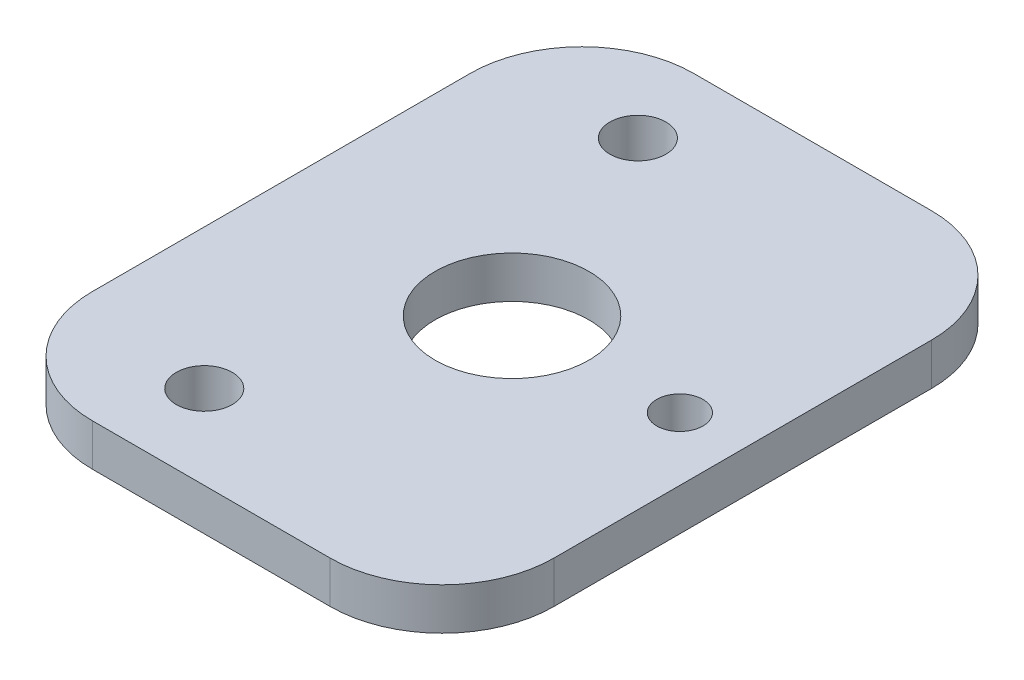
ISO-10303-21;
HEADER;
FILE_DESCRIPTION(('STEP AP214'),'2;1');
FILE_NAME('part.step','',(''),(''),'','','');
FILE_SCHEMA(('AUTOMOTIVE_DESIGN { 1 0 10303 214 1 1 1 1 }'));
ENDSEC;
DATA;
#1=APPLICATION_CONTEXT('core data for automotive mechanical design processes');
#2=APPLICATION_PROTOCOL_DEFINITION('international standard','automotive_design',2000,#1);
#3=PRODUCT_CONTEXT('',#1,'mechanical');
#4=PRODUCT('Part','Part','',(#3));
#5=PRODUCT_RELATED_PRODUCT_CATEGORY('part','',(#4));
#6=PRODUCT_DEFINITION_FORMATION('','',#4);
#7=PRODUCT_DEFINITION_CONTEXT('part definition',#1,'design');
#8=PRODUCT_DEFINITION('design','',#6,#7);
#9=PRODUCT_DEFINITION_SHAPE('','',#8);
#10=(LENGTH_UNIT() NAMED_UNIT(*) SI_UNIT(.MILLI.,.METRE.));
#11=(NAMED_UNIT(*) PLANE_ANGLE_UNIT() SI_UNIT($,.RADIAN.));
#12=(NAMED_UNIT(*) SI_UNIT($,.STERADIAN.) SOLID_ANGLE_UNIT());
#13=UNCERTAINTY_MEASURE_WITH_UNIT(LENGTH_MEASURE(1.E-05),#10,'distance_accuracy_value','');
#14=(GEOMETRIC_REPRESENTATION_CONTEXT(3) GLOBAL_UNCERTAINTY_ASSIGNED_CONTEXT((#13)) GLOBAL_UNIT_ASSIGNED_CONTEXT((#10,
#11,#12)) REPRESENTATION_CONTEXT('',''));
#15=CARTESIAN_POINT('',(0.,0.,0.));
#16=DIRECTION('',(0.,0.,1.));
#17=DIRECTION('',(1.,0.,0.));
#18=AXIS2_PLACEMENT_3D('',#15,#16,#17);
#19=CARTESIAN_POINT('',(0.,3.,0.));
#20=DIRECTION('',(0.,1.,0.));
#21=DIRECTION('',(0.,0.,1.));
#22=AXIS2_PLACEMENT_3D('',#19,#20,#21);
#23=PLANE('',#22);
#24=CARTESIAN_POINT('',(-6.49999999999999,3.,-15.5));
#25=DIRECTION('',(0.,1.,0.));
#26=DIRECTION('',(0.,0.,1.));
#27=AXIS2_PLACEMENT_3D('',#24,#25,#26);
#28=CIRCLE('',#27,2.00000000000001);
#29=CARTESIAN_POINT('',(-6.49999999999999,3.,-13.5));
#30=VERTEX_POINT('',#29);
#31=EDGE_CURVE('E147',#30,#30,#28,.T.);
#32=ORIENTED_EDGE('',*,*,#31,.F.);
#33=EDGE_LOOP('',(#32));
#34=FACE_BOUND('',#33,.T.);
#35=CARTESIAN_POINT('',(-6.49999999999998,3.,15.5));
#36=DIRECTION('',(0.,1.,0.));
#37=DIRECTION('',(0.,0.,1.));
#38=AXIS2_PLACEMENT_3D('',#35,#36,#37);
#39=CIRCLE('',#38,2.00000000000001);
#40=CARTESIAN_POINT('',(-6.49999999999998,3.,17.5));
#41=VERTEX_POINT('',#40);
#42=EDGE_CURVE('E202',#41,#41,#39,.T.);
#43=ORIENTED_EDGE('',*,*,#42,.F.);
#44=EDGE_LOOP('',(#43));
#45=FACE_BOUND('',#44,.T.);
#46=CARTESIAN_POINT('',(12.,3.,0.));
#47=DIRECTION('',(0.,1.,0.));
#48=DIRECTION('',(0.,0.,1.));
#49=AXIS2_PLACEMENT_3D('',#46,#47,#48);
#50=CIRCLE('',#49,1.65);
#51=CARTESIAN_POINT('',(12.,3.,1.65));
#52=VERTEX_POINT('',#51);
#53=EDGE_CURVE('E199',#52,#52,#50,.T.);
#54=ORIENTED_EDGE('',*,*,#53,.F.);
#55=EDGE_LOOP('',(#54));
#56=FACE_BOUND('',#55,.T.);
#57=DIRECTION('',(0.,0.,-1.));
#58=VECTOR('',#57,1.);
#59=CARTESIAN_POINT('',(16.5,3.,-21.5));
#60=LINE('',#59,#58);
#61=CARTESIAN_POINT('',(16.5,3.,13.5));
#62=VERTEX_POINT('',#61);
#63=CARTESIAN_POINT('',(16.5,3.,-13.5));
#64=VERTEX_POINT('',#63);
#65=EDGE_CURVE('E142',#62,#64,#60,.T.);
#66=ORIENTED_EDGE('',*,*,#65,.T.);
#67=CARTESIAN_POINT('',(8.5,3.,-13.5));
#68=DIRECTION('',(0.,1.,0.));
#69=DIRECTION('',(0.,0.,1.));
#70=AXIS2_PLACEMENT_3D('',#67,#68,#69);
#71=CIRCLE('',#70,8.);
#72=CARTESIAN_POINT('',(8.5,3.,-21.5));
#73=VERTEX_POINT('',#72);
#74=EDGE_CURVE('E169',#64,#73,#71,.T.);
#75=ORIENTED_EDGE('',*,*,#74,.T.);
#76=DIRECTION('',(-1.,0.,0.));
#77=VECTOR('',#76,1.);
#78=CARTESIAN_POINT('',(-16.5,3.,-21.5));
#79=LINE('',#78,#77);
#80=CARTESIAN_POINT('',(-8.49999999999999,3.,-21.5));
#81=VERTEX_POINT('',#80);
#82=EDGE_CURVE('E124',#73,#81,#79,.T.);
#83=ORIENTED_EDGE('',*,*,#82,.T.);
#84=CARTESIAN_POINT('',(-8.49999999999999,3.,-13.5));
#85=DIRECTION('',(0.,1.,0.));
#86=DIRECTION('',(0.,0.,1.));
#87=AXIS2_PLACEMENT_3D('',#84,#85,#86);
#88=CIRCLE('',#87,8.);
#89=CARTESIAN_POINT('',(-16.5,3.,-13.5));
#90=VERTEX_POINT('',#89);
#91=EDGE_CURVE('E164',#81,#90,#88,.T.);
#92=ORIENTED_EDGE('',*,*,#91,.T.);
#93=DIRECTION('',(0.,0.,1.));
#94=VECTOR('',#93,1.);
#95=CARTESIAN_POINT('',(-16.5,3.,-21.5));
#96=LINE('',#95,#94);
#97=CARTESIAN_POINT('',(-16.5,3.,13.5));
#98=VERTEX_POINT('',#97);
#99=EDGE_CURVE('E180',#90,#98,#96,.T.);
#100=ORIENTED_EDGE('',*,*,#99,.T.);
#101=CARTESIAN_POINT('',(-8.49999999999999,3.,13.5));
#102=DIRECTION('',(0.,1.,0.));
#103=DIRECTION('',(0.,0.,1.));
#104=AXIS2_PLACEMENT_3D('',#101,#102,#103);
#105=CIRCLE('',#104,8.);
#106=CARTESIAN_POINT('',(-8.49999999999999,3.,21.5));
#107=VERTEX_POINT('',#106);
#108=EDGE_CURVE('E60',#98,#107,#105,.T.);
#109=ORIENTED_EDGE('',*,*,#108,.T.);
#110=DIRECTION('',(1.,0.,0.));
#111=VECTOR('',#110,1.);
#112=CARTESIAN_POINT('',(-16.5,3.,21.5));
#113=LINE('',#112,#111);
#114=CARTESIAN_POINT('',(8.50000000000001,3.,21.5));
#115=VERTEX_POINT('',#114);
#116=EDGE_CURVE('E154',#107,#115,#113,.T.);
#117=ORIENTED_EDGE('',*,*,#116,.T.);
#118=CARTESIAN_POINT('',(8.50000000000001,3.,13.5));
#119=DIRECTION('',(0.,1.,0.));
#120=DIRECTION('',(0.,0.,1.));
#121=AXIS2_PLACEMENT_3D('',#118,#119,#120);
#122=CIRCLE('',#121,8.);
#123=EDGE_CURVE('E167',#115,#62,#122,.T.);
#124=ORIENTED_EDGE('',*,*,#123,.T.);
#125=EDGE_LOOP('',(#66,#75,#83,#92,#100,#109,#117,#124));
#126=FACE_BOUND('',#125,.T.);
#127=CARTESIAN_POINT('',(0.,3.,0.));
#128=DIRECTION('',(0.,1.,0.));
#129=DIRECTION('',(0.,0.,1.));
#130=AXIS2_PLACEMENT_3D('',#127,#128,#129);
#131=CIRCLE('',#130,5.5);
#132=CARTESIAN_POINT('',(0.,3.,5.5));
#133=VERTEX_POINT('',#132);
#134=EDGE_CURVE('E137',#133,#133,#131,.T.);
#135=ORIENTED_EDGE('',*,*,#134,.F.);
#136=EDGE_LOOP('',(#135));
#137=FACE_BOUND('',#136,.T.);
#138=ADVANCED_FACE('F38',(#34,#45,#56,#126,#137),#23,.T.);
#139=CARTESIAN_POINT('',(0.,0.,0.));
#140=DIRECTION('',(0.,1.,0.));
#141=DIRECTION('',(0.,0.,1.));
#142=AXIS2_PLACEMENT_3D('',#139,#140,#141);
#143=PLANE('',#142);
#144=CARTESIAN_POINT('',(-6.49999999999999,0.,-15.5));
#145=DIRECTION('',(0.,1.,0.));
#146=DIRECTION('',(0.,0.,1.));
#147=AXIS2_PLACEMENT_3D('',#144,#145,#146);
#148=CIRCLE('',#147,2.00000000000001);
#149=CARTESIAN_POINT('',(-6.49999999999999,0.,-13.5));
#150=VERTEX_POINT('',#149);
#151=EDGE_CURVE('E150',#150,#150,#148,.T.);
#152=ORIENTED_EDGE('',*,*,#151,.T.);
#153=EDGE_LOOP('',(#152));
#154=FACE_BOUND('',#153,.T.);
#155=CARTESIAN_POINT('',(-6.49999999999998,0.,15.5));
#156=DIRECTION('',(0.,1.,0.));
#157=DIRECTION('',(0.,0.,1.));
#158=AXIS2_PLACEMENT_3D('',#155,#156,#157);
#159=CIRCLE('',#158,2.00000000000001);
#160=CARTESIAN_POINT('',(-6.49999999999998,0.,17.5));
#161=VERTEX_POINT('',#160);
#162=EDGE_CURVE('E146',#161,#161,#159,.T.);
#163=ORIENTED_EDGE('',*,*,#162,.T.);
#164=EDGE_LOOP('',(#163));
#165=FACE_BOUND('',#164,.T.);
#166=CARTESIAN_POINT('',(12.,0.,0.));
#167=DIRECTION('',(0.,1.,0.));
#168=DIRECTION('',(0.,0.,1.));
#169=AXIS2_PLACEMENT_3D('',#166,#167,#168);
#170=CIRCLE('',#169,1.65);
#171=CARTESIAN_POINT('',(12.,0.,1.65));
#172=VERTEX_POINT('',#171);
#173=EDGE_CURVE('E143',#172,#172,#170,.T.);
#174=ORIENTED_EDGE('',*,*,#173,.T.);
#175=EDGE_LOOP('',(#174));
#176=FACE_BOUND('',#175,.T.);
#177=DIRECTION('',(-1.,0.,0.));
#178=VECTOR('',#177,1.);
#179=CARTESIAN_POINT('',(-16.5,0.,-21.5));
#180=LINE('',#179,#178);
#181=CARTESIAN_POINT('',(8.5,0.,-21.5));
#182=VERTEX_POINT('',#181);
#183=CARTESIAN_POINT('',(-8.49999999999999,0.,-21.5));
#184=VERTEX_POINT('',#183);
#185=EDGE_CURVE('E121',#182,#184,#180,.T.);
#186=ORIENTED_EDGE('',*,*,#185,.F.);
#187=CARTESIAN_POINT('',(8.5,0.,-13.5));
#188=DIRECTION('',(0.,1.,0.));
#189=DIRECTION('',(0.,0.,1.));
#190=AXIS2_PLACEMENT_3D('',#187,#188,#189);
#191=CIRCLE('',#190,8.);
#192=CARTESIAN_POINT('',(16.5,0.,-13.5));
#193=VERTEX_POINT('',#192);
#194=EDGE_CURVE('E104',#182,#193,#191,.F.);
#195=ORIENTED_EDGE('',*,*,#194,.T.);
#196=DIRECTION('',(0.,0.,-1.));
#197=VECTOR('',#196,1.);
#198=CARTESIAN_POINT('',(16.5,0.,-21.5));
#199=LINE('',#198,#197);
#200=CARTESIAN_POINT('',(16.5,0.,13.5));
#201=VERTEX_POINT('',#200);
#202=EDGE_CURVE('E132',#201,#193,#199,.T.);
#203=ORIENTED_EDGE('',*,*,#202,.F.);
#204=CARTESIAN_POINT('',(8.50000000000001,0.,13.5));
#205=DIRECTION('',(0.,1.,0.));
#206=DIRECTION('',(0.,0.,1.));
#207=AXIS2_PLACEMENT_3D('',#204,#205,#206);
#208=CIRCLE('',#207,8.);
#209=CARTESIAN_POINT('',(8.50000000000001,0.,21.5));
#210=VERTEX_POINT('',#209);
#211=EDGE_CURVE('E115',#201,#210,#208,.F.);
#212=ORIENTED_EDGE('',*,*,#211,.T.);
#213=DIRECTION('',(1.,0.,0.));
#214=VECTOR('',#213,1.);
#215=CARTESIAN_POINT('',(-16.5,0.,21.5));
#216=LINE('',#215,#214);
#217=CARTESIAN_POINT('',(-8.49999999999999,0.,21.5));
#218=VERTEX_POINT('',#217);
#219=EDGE_CURVE('E135',#218,#210,#216,.T.);
#220=ORIENTED_EDGE('',*,*,#219,.F.);
#221=CARTESIAN_POINT('',(-8.49999999999999,0.,13.5));
#222=DIRECTION('',(0.,1.,0.));
#223=DIRECTION('',(0.,0.,1.));
#224=AXIS2_PLACEMENT_3D('',#221,#222,#223);
#225=CIRCLE('',#224,8.);
#226=CARTESIAN_POINT('',(-16.5,0.,13.5));
#227=VERTEX_POINT('',#226);
#228=EDGE_CURVE('E157',#218,#227,#225,.F.);
#229=ORIENTED_EDGE('',*,*,#228,.T.);
#230=DIRECTION('',(0.,0.,1.));
#231=VECTOR('',#230,1.);
#232=CARTESIAN_POINT('',(-16.5,0.,-21.5));
#233=LINE('',#232,#231);
#234=CARTESIAN_POINT('',(-16.5,0.,-13.5));
#235=VERTEX_POINT('',#234);
#236=EDGE_CURVE('E131',#235,#227,#233,.T.);
#237=ORIENTED_EDGE('',*,*,#236,.F.);
#238=CARTESIAN_POINT('',(-8.49999999999999,0.,-13.5));
#239=DIRECTION('',(0.,1.,0.));
#240=DIRECTION('',(0.,0.,1.));
#241=AXIS2_PLACEMENT_3D('',#238,#239,#240);
#242=CIRCLE('',#241,8.);
#243=EDGE_CURVE('E125',#235,#184,#242,.F.);
#244=ORIENTED_EDGE('',*,*,#243,.T.);
#245=EDGE_LOOP('',(#186,#195,#203,#212,#220,#229,#237,#244));
#246=FACE_BOUND('',#245,.T.);
#247=CARTESIAN_POINT('',(0.,0.,0.));
#248=DIRECTION('',(0.,1.,0.));
#249=DIRECTION('',(0.,0.,1.));
#250=AXIS2_PLACEMENT_3D('',#247,#248,#249);
#251=CIRCLE('',#250,5.5);
#252=CARTESIAN_POINT('',(0.,0.,5.5));
#253=VERTEX_POINT('',#252);
#254=EDGE_CURVE('E153',#253,#253,#251,.T.);
#255=ORIENTED_EDGE('',*,*,#254,.T.);
#256=EDGE_LOOP('',(#255));
#257=FACE_BOUND('',#256,.T.);
#258=ADVANCED_FACE('F128',(#154,#165,#176,#246,#257),#143,.F.);
#259=CARTESIAN_POINT('',(16.5,3.,-21.5));
#260=DIRECTION('',(-1.,0.,0.));
#261=DIRECTION('',(0.,0.,1.));
#262=AXIS2_PLACEMENT_3D('',#259,#260,#261);
#263=PLANE('',#262);
#264=ORIENTED_EDGE('',*,*,#202,.T.);
#265=DIRECTION('',(0.,-1.,0.));
#266=VECTOR('',#265,1.);
#267=CARTESIAN_POINT('',(16.5,3.,-13.5));
#268=LINE('',#267,#266);
#269=EDGE_CURVE('E109',#193,#64,#268,.F.);
#270=ORIENTED_EDGE('',*,*,#269,.T.);
#271=ORIENTED_EDGE('',*,*,#65,.F.);
#272=DIRECTION('',(0.,-1.,0.));
#273=VECTOR('',#272,1.);
#274=CARTESIAN_POINT('',(16.5,3.,13.5));
#275=LINE('',#274,#273);
#276=EDGE_CURVE('E114',#62,#201,#275,.T.);
#277=ORIENTED_EDGE('',*,*,#276,.T.);
#278=EDGE_LOOP('',(#264,#270,#271,#277));
#279=FACE_BOUND('',#278,.T.);
#280=ADVANCED_FACE('F228',(#279),#263,.F.);
#281=CARTESIAN_POINT('',(-16.5,3.,-21.5));
#282=DIRECTION('',(0.,0.,1.));
#283=DIRECTION('',(1.,0.,0.));
#284=AXIS2_PLACEMENT_3D('',#281,#282,#283);
#285=PLANE('',#284);
#286=ORIENTED_EDGE('',*,*,#82,.F.);
#287=DIRECTION('',(0.,-1.,0.));
#288=VECTOR('',#287,1.);
#289=CARTESIAN_POINT('',(8.5,3.,-21.5));
#290=LINE('',#289,#288);
#291=EDGE_CURVE('E108',#73,#182,#290,.T.);
#292=ORIENTED_EDGE('',*,*,#291,.T.);
#293=ORIENTED_EDGE('',*,*,#185,.T.);
#294=DIRECTION('',(0.,-1.,0.));
#295=VECTOR('',#294,1.);
#296=CARTESIAN_POINT('',(-8.49999999999999,3.,-21.5));
#297=LINE('',#296,#295);
#298=EDGE_CURVE('E126',#184,#81,#297,.F.);
#299=ORIENTED_EDGE('',*,*,#298,.T.);
#300=EDGE_LOOP('',(#286,#292,#293,#299));
#301=FACE_BOUND('',#300,.T.);
#302=ADVANCED_FACE('F120',(#301),#285,.F.);
#303=CARTESIAN_POINT('',(-16.5,3.,-21.5));
#304=DIRECTION('',(1.,0.,0.));
#305=DIRECTION('',(0.,0.,-1.));
#306=AXIS2_PLACEMENT_3D('',#303,#304,#305);
#307=PLANE('',#306);
#308=ORIENTED_EDGE('',*,*,#236,.T.);
#309=DIRECTION('',(0.,-1.,0.));
#310=VECTOR('',#309,1.);
#311=CARTESIAN_POINT('',(-16.5,3.,13.5));
#312=LINE('',#311,#310);
#313=EDGE_CURVE('E11',#227,#98,#312,.F.);
#314=ORIENTED_EDGE('',*,*,#313,.T.);
#315=ORIENTED_EDGE('',*,*,#99,.F.);
#316=DIRECTION('',(0.,-1.,0.));
#317=VECTOR('',#316,1.);
#318=CARTESIAN_POINT('',(-16.5,3.,-13.5));
#319=LINE('',#318,#317);
#320=EDGE_CURVE('E46',#90,#235,#319,.T.);
#321=ORIENTED_EDGE('',*,*,#320,.T.);
#322=EDGE_LOOP('',(#308,#314,#315,#321));
#323=FACE_BOUND('',#322,.T.);
#324=ADVANCED_FACE('F178',(#323),#307,.F.);
#325=CARTESIAN_POINT('',(-16.5,3.,21.5));
#326=DIRECTION('',(0.,0.,-1.));
#327=DIRECTION('',(-1.,0.,0.));
#328=AXIS2_PLACEMENT_3D('',#325,#326,#327);
#329=PLANE('',#328);
#330=ORIENTED_EDGE('',*,*,#219,.T.);
#331=DIRECTION('',(0.,-1.,0.));
#332=VECTOR('',#331,1.);
#333=CARTESIAN_POINT('',(8.50000000000001,3.,21.5));
#334=LINE('',#333,#332);
#335=EDGE_CURVE('E53',#210,#115,#334,.F.);
#336=ORIENTED_EDGE('',*,*,#335,.T.);
#337=ORIENTED_EDGE('',*,*,#116,.F.);
#338=DIRECTION('',(0.,-1.,0.));
#339=VECTOR('',#338,1.);
#340=CARTESIAN_POINT('',(-8.49999999999999,3.,21.5));
#341=LINE('',#340,#339);
#342=EDGE_CURVE('E171',#107,#218,#341,.T.);
#343=ORIENTED_EDGE('',*,*,#342,.T.);
#344=EDGE_LOOP('',(#330,#336,#337,#343));
#345=FACE_BOUND('',#344,.T.);
#346=ADVANCED_FACE('F187',(#345),#329,.F.);
#347=CARTESIAN_POINT('',(0.,3.,0.));
#348=DIRECTION('',(0.,-1.,0.));
#349=DIRECTION('',(0.,0.,-1.));
#350=AXIS2_PLACEMENT_3D('',#347,#348,#349);
#351=CYLINDRICAL_SURFACE('',#350,5.5);
#352=ORIENTED_EDGE('',*,*,#134,.T.);
#353=EDGE_LOOP('',(#352));
#354=FACE_BOUND('',#353,.T.);
#355=ORIENTED_EDGE('',*,*,#254,.F.);
#356=EDGE_LOOP('',(#355));
#357=FACE_BOUND('',#356,.T.);
#358=ADVANCED_FACE('F221',(#354,#357),#351,.F.);
#359=CARTESIAN_POINT('',(12.,-7.,0.));
#360=DIRECTION('',(0.,1.,0.));
#361=DIRECTION('',(0.,0.,1.));
#362=AXIS2_PLACEMENT_3D('',#359,#360,#361);
#363=CYLINDRICAL_SURFACE('',#362,1.65);
#364=ORIENTED_EDGE('',*,*,#53,.T.);
#365=EDGE_LOOP('',(#364));
#366=FACE_BOUND('',#365,.T.);
#367=ORIENTED_EDGE('',*,*,#173,.F.);
#368=EDGE_LOOP('',(#367));
#369=FACE_BOUND('',#368,.T.);
#370=ADVANCED_FACE('F224',(#366,#369),#363,.F.);
#371=CARTESIAN_POINT('',(-6.49999999999998,-7.,15.5));
#372=DIRECTION('',(0.,1.,0.));
#373=DIRECTION('',(0.,0.,1.));
#374=AXIS2_PLACEMENT_3D('',#371,#372,#373);
#375=CYLINDRICAL_SURFACE('',#374,2.00000000000001);
#376=ORIENTED_EDGE('',*,*,#42,.T.);
#377=EDGE_LOOP('',(#376));
#378=FACE_BOUND('',#377,.T.);
#379=ORIENTED_EDGE('',*,*,#162,.F.);
#380=EDGE_LOOP('',(#379));
#381=FACE_BOUND('',#380,.T.);
#382=ADVANCED_FACE('F316',(#378,#381),#375,.F.);
#383=CARTESIAN_POINT('',(-6.49999999999999,-7.,-15.5));
#384=DIRECTION('',(0.,1.,0.));
#385=DIRECTION('',(0.,0.,1.));
#386=AXIS2_PLACEMENT_3D('',#383,#384,#385);
#387=CYLINDRICAL_SURFACE('',#386,2.00000000000001);
#388=ORIENTED_EDGE('',*,*,#31,.T.);
#389=EDGE_LOOP('',(#388));
#390=FACE_BOUND('',#389,.T.);
#391=ORIENTED_EDGE('',*,*,#151,.F.);
#392=EDGE_LOOP('',(#391));
#393=FACE_BOUND('',#392,.T.);
#394=ADVANCED_FACE('F208',(#390,#393),#387,.F.);
#395=CARTESIAN_POINT('',(8.5,3.,-13.5));
#396=DIRECTION('',(0.,-1.,0.));
#397=DIRECTION('',(0.,0.,-1.));
#398=AXIS2_PLACEMENT_3D('',#395,#396,#397);
#399=CYLINDRICAL_SURFACE('',#398,8.);
#400=ORIENTED_EDGE('',*,*,#74,.F.);
#401=ORIENTED_EDGE('',*,*,#269,.F.);
#402=ORIENTED_EDGE('',*,*,#194,.F.);
#403=ORIENTED_EDGE('',*,*,#291,.F.);
#404=EDGE_LOOP('',(#400,#401,#402,#403));
#405=FACE_BOUND('',#404,.T.);
#406=ADVANCED_FACE('F107',(#405),#399,.T.);
#407=CARTESIAN_POINT('',(8.50000000000001,3.,13.5));
#408=DIRECTION('',(0.,-1.,0.));
#409=DIRECTION('',(0.,0.,-1.));
#410=AXIS2_PLACEMENT_3D('',#407,#408,#409);
#411=CYLINDRICAL_SURFACE('',#410,8.);
#412=ORIENTED_EDGE('',*,*,#123,.F.);
#413=ORIENTED_EDGE('',*,*,#335,.F.);
#414=ORIENTED_EDGE('',*,*,#211,.F.);
#415=ORIENTED_EDGE('',*,*,#276,.F.);
#416=EDGE_LOOP('',(#412,#413,#414,#415));
#417=FACE_BOUND('',#416,.T.);
#418=ADVANCED_FACE('F246',(#417),#411,.T.);
#419=CARTESIAN_POINT('',(-8.49999999999999,3.,13.5));
#420=DIRECTION('',(0.,-1.,0.));
#421=DIRECTION('',(0.,0.,-1.));
#422=AXIS2_PLACEMENT_3D('',#419,#420,#421);
#423=CYLINDRICAL_SURFACE('',#422,8.);
#424=ORIENTED_EDGE('',*,*,#108,.F.);
#425=ORIENTED_EDGE('',*,*,#313,.F.);
#426=ORIENTED_EDGE('',*,*,#228,.F.);
#427=ORIENTED_EDGE('',*,*,#342,.F.);
#428=EDGE_LOOP('',(#424,#425,#426,#427));
#429=FACE_BOUND('',#428,.T.);
#430=ADVANCED_FACE('F186',(#429),#423,.T.);
#431=CARTESIAN_POINT('',(-8.49999999999999,3.,-13.5));
#432=DIRECTION('',(0.,-1.,0.));
#433=DIRECTION('',(0.,0.,-1.));
#434=AXIS2_PLACEMENT_3D('',#431,#432,#433);
#435=CYLINDRICAL_SURFACE('',#434,8.);
#436=ORIENTED_EDGE('',*,*,#91,.F.);
#437=ORIENTED_EDGE('',*,*,#298,.F.);
#438=ORIENTED_EDGE('',*,*,#243,.F.);
#439=ORIENTED_EDGE('',*,*,#320,.F.);
#440=EDGE_LOOP('',(#436,#437,#438,#439));
#441=FACE_BOUND('',#440,.T.);
#442=ADVANCED_FACE('F40',(#441),#435,.T.);
#443=CLOSED_SHELL('',(#138,#258,#280,#302,#324,#346,#358,#370,#382,#394,#406,#418,#430,#442));
#444=MANIFOLD_SOLID_BREP('B2',#443);
#445=ADVANCED_BREP_SHAPE_REPRESENTATION('',(#18,#444),#14);
#446=SHAPE_DEFINITION_REPRESENTATION(#9,#445);
ENDSEC;
END-ISO-10303-21;
